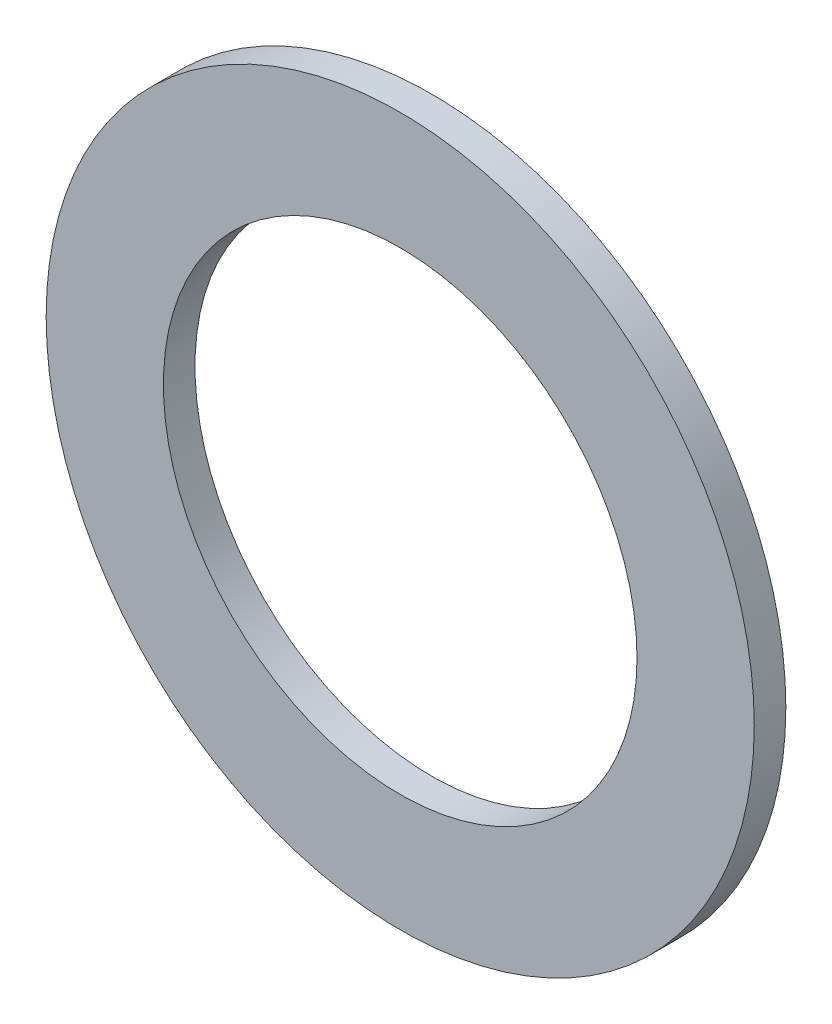
ISO-10303-21;
HEADER;
FILE_DESCRIPTION(('STEP AP214'),'2;1');
FILE_NAME('part.step','',(''),(''),'','','');
FILE_SCHEMA(('AUTOMOTIVE_DESIGN { 1 0 10303 214 1 1 1 1 }'));
ENDSEC;
DATA;
#1=APPLICATION_CONTEXT('core data for automotive mechanical design processes');
#2=APPLICATION_PROTOCOL_DEFINITION('international standard','automotive_design',2000,#1);
#3=PRODUCT_CONTEXT('',#1,'mechanical');
#4=PRODUCT('Part','Part','',(#3));
#5=PRODUCT_RELATED_PRODUCT_CATEGORY('part','',(#4));
#6=PRODUCT_DEFINITION_FORMATION('','',#4);
#7=PRODUCT_DEFINITION_CONTEXT('part definition',#1,'design');
#8=PRODUCT_DEFINITION('design','',#6,#7);
#9=PRODUCT_DEFINITION_SHAPE('','',#8);
#10=(LENGTH_UNIT() NAMED_UNIT(*) SI_UNIT(.MILLI.,.METRE.));
#11=(NAMED_UNIT(*) PLANE_ANGLE_UNIT() SI_UNIT($,.RADIAN.));
#12=(NAMED_UNIT(*) SI_UNIT($,.STERADIAN.) SOLID_ANGLE_UNIT());
#13=UNCERTAINTY_MEASURE_WITH_UNIT(LENGTH_MEASURE(1.E-05),#10,'distance_accuracy_value','');
#14=(GEOMETRIC_REPRESENTATION_CONTEXT(3) GLOBAL_UNCERTAINTY_ASSIGNED_CONTEXT((#13)) GLOBAL_UNIT_ASSIGNED_CONTEXT((#10,
#11,#12)) REPRESENTATION_CONTEXT('',''));
#15=CARTESIAN_POINT('',(0.,0.,0.));
#16=DIRECTION('',(0.,0.,1.));
#17=DIRECTION('',(1.,0.,0.));
#18=AXIS2_PLACEMENT_3D('',#15,#16,#17);
#19=CARTESIAN_POINT('',(0.,0.,-10.));
#20=DIRECTION('',(0.,0.,1.));
#21=DIRECTION('',(1.,0.,0.));
#22=AXIS2_PLACEMENT_3D('',#19,#20,#21);
#23=CYLINDRICAL_SURFACE('',#22,112.14);
#24=CARTESIAN_POINT('',(0.,0.,-10.));
#25=DIRECTION('',(0.,0.,1.));
#26=DIRECTION('',(1.,0.,0.));
#27=AXIS2_PLACEMENT_3D('',#24,#25,#26);
#28=CIRCLE('',#27,112.14);
#29=CARTESIAN_POINT('',(112.14,0.,-10.));
#30=VERTEX_POINT('',#29);
#31=EDGE_CURVE('E10',#30,#30,#28,.T.);
#32=ORIENTED_EDGE('',*,*,#31,.T.);
#33=EDGE_LOOP('',(#32));
#34=FACE_BOUND('',#33,.T.);
#35=CARTESIAN_POINT('',(0.,0.,0.));
#36=DIRECTION('',(0.,0.,1.));
#37=DIRECTION('',(1.,0.,0.));
#38=AXIS2_PLACEMENT_3D('',#35,#36,#37);
#39=CIRCLE('',#38,112.14);
#40=CARTESIAN_POINT('',(112.14,0.,0.));
#41=VERTEX_POINT('',#40);
#42=EDGE_CURVE('E40',#41,#41,#39,.T.);
#43=ORIENTED_EDGE('',*,*,#42,.F.);
#44=EDGE_LOOP('',(#43));
#45=FACE_BOUND('',#44,.T.);
#46=ADVANCED_FACE('F37',(#34,#45),#23,.T.);
#47=CARTESIAN_POINT('',(0.,0.,-10.));
#48=DIRECTION('',(0.,0.,1.));
#49=DIRECTION('',(1.,0.,0.));
#50=AXIS2_PLACEMENT_3D('',#47,#48,#49);
#51=PLANE('',#50);
#52=CARTESIAN_POINT('',(0.,0.,-10.));
#53=DIRECTION('',(0.,0.,1.));
#54=DIRECTION('',(1.,0.,0.));
#55=AXIS2_PLACEMENT_3D('',#52,#53,#54);
#56=CIRCLE('',#55,75.);
#57=CARTESIAN_POINT('',(75.,0.,-10.));
#58=VERTEX_POINT('',#57);
#59=EDGE_CURVE('E47',#58,#58,#56,.T.);
#60=ORIENTED_EDGE('',*,*,#59,.T.);
#61=EDGE_LOOP('',(#60));
#62=FACE_BOUND('',#61,.T.);
#63=ORIENTED_EDGE('',*,*,#31,.F.);
#64=EDGE_LOOP('',(#63));
#65=FACE_BOUND('',#64,.T.);
#66=ADVANCED_FACE('F55',(#62,#65),#51,.F.);
#67=CARTESIAN_POINT('',(0.,0.,0.));
#68=DIRECTION('',(0.,0.,1.));
#69=DIRECTION('',(1.,0.,0.));
#70=AXIS2_PLACEMENT_3D('',#67,#68,#69);
#71=PLANE('',#70);
#72=CARTESIAN_POINT('',(0.,0.,0.));
#73=DIRECTION('',(0.,0.,1.));
#74=DIRECTION('',(1.,0.,0.));
#75=AXIS2_PLACEMENT_3D('',#72,#73,#74);
#76=CIRCLE('',#75,75.);
#77=CARTESIAN_POINT('',(75.,0.,0.));
#78=VERTEX_POINT('',#77);
#79=EDGE_CURVE('E49',#78,#78,#76,.T.);
#80=ORIENTED_EDGE('',*,*,#79,.F.);
#81=EDGE_LOOP('',(#80));
#82=FACE_BOUND('',#81,.T.);
#83=ORIENTED_EDGE('',*,*,#42,.T.);
#84=EDGE_LOOP('',(#83));
#85=FACE_BOUND('',#84,.T.);
#86=ADVANCED_FACE('F61',(#82,#85),#71,.T.);
#87=CARTESIAN_POINT('',(0.,0.,-10.));
#88=DIRECTION('',(0.,0.,1.));
#89=DIRECTION('',(1.,0.,0.));
#90=AXIS2_PLACEMENT_3D('',#87,#88,#89);
#91=CYLINDRICAL_SURFACE('',#90,75.);
#92=ORIENTED_EDGE('',*,*,#59,.F.);
#93=EDGE_LOOP('',(#92));
#94=FACE_BOUND('',#93,.T.);
#95=ORIENTED_EDGE('',*,*,#79,.T.);
#96=EDGE_LOOP('',(#95));
#97=FACE_BOUND('',#96,.T.);
#98=ADVANCED_FACE('F58',(#94,#97),#91,.F.);
#99=CLOSED_SHELL('',(#46,#66,#86,#98));
#100=MANIFOLD_SOLID_BREP('B2',#99);
#101=ADVANCED_BREP_SHAPE_REPRESENTATION('',(#18,#100),#14);
#102=SHAPE_DEFINITION_REPRESENTATION(#9,#101);
ENDSEC;
END-ISO-10303-21;
